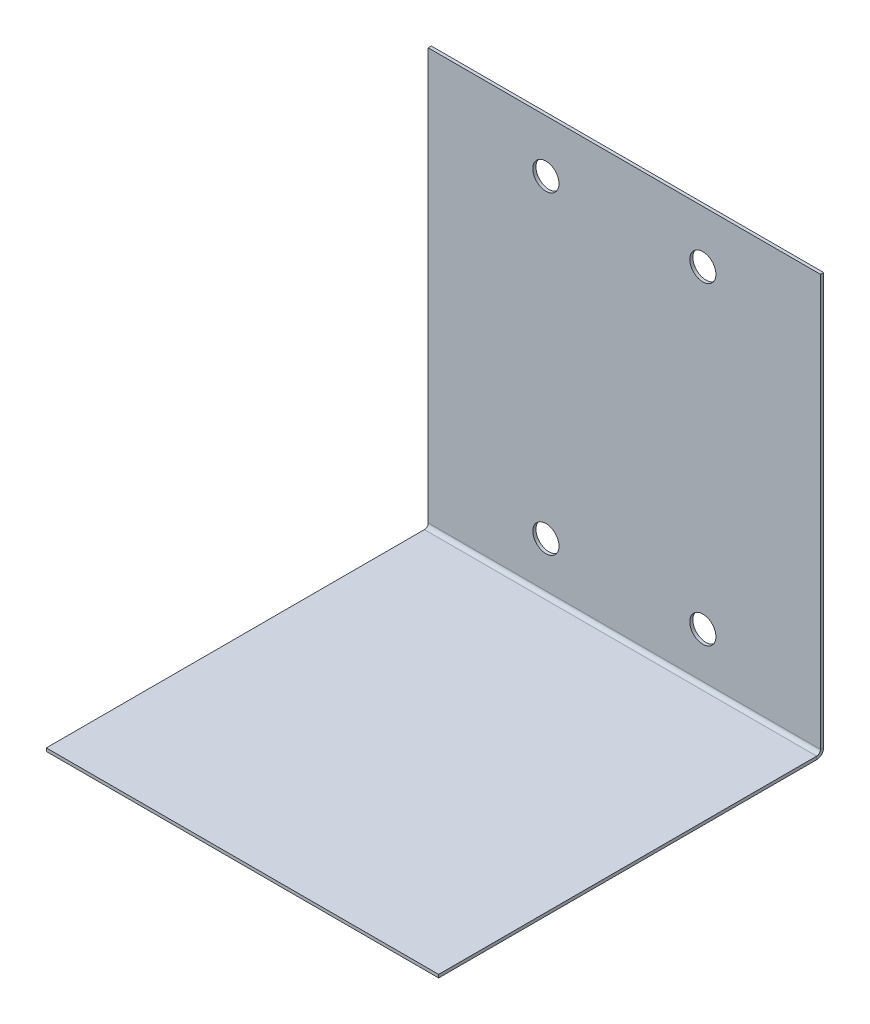
ISO-10303-21;
HEADER;
FILE_DESCRIPTION(('STEP AP214'),'2;1');
FILE_NAME('part.step','',(''),(''),'','','');
FILE_SCHEMA(('AUTOMOTIVE_DESIGN { 1 0 10303 214 1 1 1 1 }'));
ENDSEC;
DATA;
#1=APPLICATION_CONTEXT('core data for automotive mechanical design processes');
#2=APPLICATION_PROTOCOL_DEFINITION('international standard','automotive_design',2000,#1);
#3=PRODUCT_CONTEXT('',#1,'mechanical');
#4=PRODUCT('Part','Part','',(#3));
#5=PRODUCT_RELATED_PRODUCT_CATEGORY('part','',(#4));
#6=PRODUCT_DEFINITION_FORMATION('','',#4);
#7=PRODUCT_DEFINITION_CONTEXT('part definition',#1,'design');
#8=PRODUCT_DEFINITION('design','',#6,#7);
#9=PRODUCT_DEFINITION_SHAPE('','',#8);
#10=(LENGTH_UNIT() NAMED_UNIT(*) SI_UNIT(.MILLI.,.METRE.));
#11=(NAMED_UNIT(*) PLANE_ANGLE_UNIT() SI_UNIT($,.RADIAN.));
#12=(NAMED_UNIT(*) SI_UNIT($,.STERADIAN.) SOLID_ANGLE_UNIT());
#13=UNCERTAINTY_MEASURE_WITH_UNIT(LENGTH_MEASURE(1.E-05),#10,'distance_accuracy_value','');
#14=(GEOMETRIC_REPRESENTATION_CONTEXT(3) GLOBAL_UNCERTAINTY_ASSIGNED_CONTEXT((#13)) GLOBAL_UNIT_ASSIGNED_CONTEXT((#10,
#11,#12)) REPRESENTATION_CONTEXT('',''));
#15=CARTESIAN_POINT('',(0.,0.,0.));
#16=DIRECTION('',(0.,0.,1.));
#17=DIRECTION('',(1.,0.,0.));
#18=AXIS2_PLACEMENT_3D('',#15,#16,#17);
#19=CARTESIAN_POINT('',(75.,0.,-0.6));
#20=DIRECTION('',(1.,0.,0.));
#21=DIRECTION('',(0.,0.,-1.));
#22=AXIS2_PLACEMENT_3D('',#19,#20,#21);
#23=PLANE('',#22);
#24=DIRECTION('',(0.,1.,0.));
#25=VECTOR('',#24,1.);
#26=CARTESIAN_POINT('',(75.,0.,0.));
#27=LINE('',#26,#25);
#28=CARTESIAN_POINT('',(75.,1.3366,0.));
#29=VERTEX_POINT('',#28);
#30=CARTESIAN_POINT('',(75.,80.,0.));
#31=VERTEX_POINT('',#30);
#32=EDGE_CURVE('E107',#29,#31,#27,.T.);
#33=ORIENTED_EDGE('',*,*,#32,.F.);
#34=DIRECTION('',(0.,0.,-1.));
#35=VECTOR('',#34,1.);
#36=CARTESIAN_POINT('',(75.,1.3366,0.));
#37=LINE('',#36,#35);
#38=CARTESIAN_POINT('',(75.,1.3366,-0.6));
#39=VERTEX_POINT('',#38);
#40=EDGE_CURVE('E144',#29,#39,#37,.T.);
#41=ORIENTED_EDGE('',*,*,#40,.T.);
#42=DIRECTION('',(0.,1.,0.));
#43=VECTOR('',#42,1.);
#44=CARTESIAN_POINT('',(75.,0.,-0.6));
#45=LINE('',#44,#43);
#46=CARTESIAN_POINT('',(75.,80.,-0.6));
#47=VERTEX_POINT('',#46);
#48=EDGE_CURVE('E115',#39,#47,#45,.T.);
#49=ORIENTED_EDGE('',*,*,#48,.T.);
#50=DIRECTION('',(0.,0.,1.));
#51=VECTOR('',#50,1.);
#52=CARTESIAN_POINT('',(75.,80.,-0.6));
#53=LINE('',#52,#51);
#54=EDGE_CURVE('E63',#47,#31,#53,.T.);
#55=ORIENTED_EDGE('',*,*,#54,.T.);
#56=EDGE_LOOP('',(#33,#41,#49,#55));
#57=FACE_BOUND('',#56,.T.);
#58=ADVANCED_FACE('F59',(#57),#23,.T.);
#59=CARTESIAN_POINT('',(0.,0.,-0.6));
#60=DIRECTION('',(0.,0.,-1.));
#61=DIRECTION('',(-1.,0.,0.));
#62=AXIS2_PLACEMENT_3D('',#59,#60,#61);
#63=PLANE('',#62);
#64=CARTESIAN_POINT('',(22.5,10.,-0.6));
#65=DIRECTION('',(0.,0.,-1.));
#66=DIRECTION('',(-1.,0.,0.));
#67=AXIS2_PLACEMENT_3D('',#64,#65,#66);
#68=CIRCLE('',#67,2.5);
#69=CARTESIAN_POINT('',(20.,10.,-0.6));
#70=VERTEX_POINT('',#69);
#71=EDGE_CURVE('E123',#70,#70,#68,.T.);
#72=ORIENTED_EDGE('',*,*,#71,.F.);
#73=EDGE_LOOP('',(#72));
#74=FACE_BOUND('',#73,.T.);
#75=CARTESIAN_POINT('',(52.5,70.,-0.6));
#76=DIRECTION('',(0.,0.,-1.));
#77=DIRECTION('',(-1.,0.,0.));
#78=AXIS2_PLACEMENT_3D('',#75,#76,#77);
#79=CIRCLE('',#78,2.5);
#80=CARTESIAN_POINT('',(50.,70.,-0.6));
#81=VERTEX_POINT('',#80);
#82=EDGE_CURVE('E129',#81,#81,#79,.T.);
#83=ORIENTED_EDGE('',*,*,#82,.F.);
#84=EDGE_LOOP('',(#83));
#85=FACE_BOUND('',#84,.T.);
#86=CARTESIAN_POINT('',(52.5,9.99999999999999,-0.6));
#87=DIRECTION('',(0.,0.,-1.));
#88=DIRECTION('',(1.,0.,0.));
#89=AXIS2_PLACEMENT_3D('',#86,#87,#88);
#90=CIRCLE('',#89,2.49999999999999);
#91=CARTESIAN_POINT('',(55.,9.99999999999999,-0.6));
#92=VERTEX_POINT('',#91);
#93=EDGE_CURVE('E135',#92,#92,#90,.T.);
#94=ORIENTED_EDGE('',*,*,#93,.F.);
#95=EDGE_LOOP('',(#94));
#96=FACE_BOUND('',#95,.T.);
#97=CARTESIAN_POINT('',(22.5,70.,-0.6));
#98=DIRECTION('',(0.,0.,-1.));
#99=DIRECTION('',(1.,0.,0.));
#100=AXIS2_PLACEMENT_3D('',#97,#98,#99);
#101=CIRCLE('',#100,2.5);
#102=CARTESIAN_POINT('',(25.,70.,-0.6));
#103=VERTEX_POINT('',#102);
#104=EDGE_CURVE('E141',#103,#103,#101,.T.);
#105=ORIENTED_EDGE('',*,*,#104,.F.);
#106=EDGE_LOOP('',(#105));
#107=FACE_BOUND('',#106,.T.);
#108=ORIENTED_EDGE('',*,*,#48,.F.);
#109=DIRECTION('',(1.,0.,0.));
#110=VECTOR('',#109,1.);
#111=CARTESIAN_POINT('',(75.,1.3366,-0.6));
#112=LINE('',#111,#110);
#113=CARTESIAN_POINT('',(0.,1.3366,-0.6));
#114=VERTEX_POINT('',#113);
#115=EDGE_CURVE('E161',#39,#114,#112,.F.);
#116=ORIENTED_EDGE('',*,*,#115,.T.);
#117=DIRECTION('',(0.,-1.,0.));
#118=VECTOR('',#117,1.);
#119=CARTESIAN_POINT('',(0.,0.,-0.6));
#120=LINE('',#119,#118);
#121=CARTESIAN_POINT('',(0.,80.,-0.6));
#122=VERTEX_POINT('',#121);
#123=EDGE_CURVE('E113',#122,#114,#120,.T.);
#124=ORIENTED_EDGE('',*,*,#123,.F.);
#125=DIRECTION('',(-1.,0.,0.));
#126=VECTOR('',#125,1.);
#127=CARTESIAN_POINT('',(0.,80.,-0.6));
#128=LINE('',#127,#126);
#129=EDGE_CURVE('E99',#47,#122,#128,.T.);
#130=ORIENTED_EDGE('',*,*,#129,.F.);
#131=EDGE_LOOP('',(#108,#116,#124,#130));
#132=FACE_BOUND('',#131,.T.);
#133=ADVANCED_FACE('F251',(#74,#85,#96,#107,#132),#63,.T.);
#134=CARTESIAN_POINT('',(0.,0.,0.));
#135=DIRECTION('',(0.,0.,-1.));
#136=DIRECTION('',(-1.,0.,0.));
#137=AXIS2_PLACEMENT_3D('',#134,#135,#136);
#138=PLANE('',#137);
#139=CARTESIAN_POINT('',(22.5,10.,0.));
#140=DIRECTION('',(0.,0.,-1.));
#141=DIRECTION('',(-1.,0.,0.));
#142=AXIS2_PLACEMENT_3D('',#139,#140,#141);
#143=CIRCLE('',#142,2.5);
#144=CARTESIAN_POINT('',(20.,10.,0.));
#145=VERTEX_POINT('',#144);
#146=EDGE_CURVE('E108',#145,#145,#143,.F.);
#147=ORIENTED_EDGE('',*,*,#146,.F.);
#148=EDGE_LOOP('',(#147));
#149=FACE_BOUND('',#148,.T.);
#150=CARTESIAN_POINT('',(52.5,70.,0.));
#151=DIRECTION('',(0.,0.,-1.));
#152=DIRECTION('',(-1.,0.,0.));
#153=AXIS2_PLACEMENT_3D('',#150,#151,#152);
#154=CIRCLE('',#153,2.5);
#155=CARTESIAN_POINT('',(50.,70.,0.));
#156=VERTEX_POINT('',#155);
#157=EDGE_CURVE('E126',#156,#156,#154,.F.);
#158=ORIENTED_EDGE('',*,*,#157,.F.);
#159=EDGE_LOOP('',(#158));
#160=FACE_BOUND('',#159,.T.);
#161=CARTESIAN_POINT('',(52.5,9.99999999999999,0.));
#162=DIRECTION('',(0.,0.,-1.));
#163=DIRECTION('',(-1.,0.,0.));
#164=AXIS2_PLACEMENT_3D('',#161,#162,#163);
#165=CIRCLE('',#164,2.49999999999999);
#166=CARTESIAN_POINT('',(50.,9.99999999999999,0.));
#167=VERTEX_POINT('',#166);
#168=EDGE_CURVE('E132',#167,#167,#165,.F.);
#169=ORIENTED_EDGE('',*,*,#168,.F.);
#170=EDGE_LOOP('',(#169));
#171=FACE_BOUND('',#170,.T.);
#172=CARTESIAN_POINT('',(22.5,70.,0.));
#173=DIRECTION('',(0.,0.,-1.));
#174=DIRECTION('',(-1.,0.,0.));
#175=AXIS2_PLACEMENT_3D('',#172,#173,#174);
#176=CIRCLE('',#175,2.5);
#177=CARTESIAN_POINT('',(20.,70.,0.));
#178=VERTEX_POINT('',#177);
#179=EDGE_CURVE('E138',#178,#178,#176,.F.);
#180=ORIENTED_EDGE('',*,*,#179,.F.);
#181=EDGE_LOOP('',(#180));
#182=FACE_BOUND('',#181,.T.);
#183=DIRECTION('',(1.,0.,0.));
#184=VECTOR('',#183,1.);
#185=CARTESIAN_POINT('',(75.,1.3366,0.));
#186=LINE('',#185,#184);
#187=CARTESIAN_POINT('',(0.,1.3366,0.));
#188=VERTEX_POINT('',#187);
#189=EDGE_CURVE('E151',#29,#188,#186,.F.);
#190=ORIENTED_EDGE('',*,*,#189,.F.);
#191=ORIENTED_EDGE('',*,*,#32,.T.);
#192=DIRECTION('',(-1.,0.,0.));
#193=VECTOR('',#192,1.);
#194=CARTESIAN_POINT('',(0.,80.,0.));
#195=LINE('',#194,#193);
#196=CARTESIAN_POINT('',(0.,80.,0.));
#197=VERTEX_POINT('',#196);
#198=EDGE_CURVE('E97',#31,#197,#195,.T.);
#199=ORIENTED_EDGE('',*,*,#198,.T.);
#200=DIRECTION('',(0.,-1.,0.));
#201=VECTOR('',#200,1.);
#202=CARTESIAN_POINT('',(0.,0.,0.));
#203=LINE('',#202,#201);
#204=EDGE_CURVE('E102',#197,#188,#203,.T.);
#205=ORIENTED_EDGE('',*,*,#204,.T.);
#206=EDGE_LOOP('',(#190,#191,#199,#205));
#207=FACE_BOUND('',#206,.T.);
#208=ADVANCED_FACE('F110',(#149,#160,#171,#182,#207),#138,.F.);
#209=CARTESIAN_POINT('',(0.,0.,-0.6));
#210=DIRECTION('',(-1.,0.,0.));
#211=DIRECTION('',(0.,0.,1.));
#212=AXIS2_PLACEMENT_3D('',#209,#210,#211);
#213=PLANE('',#212);
#214=DIRECTION('',(0.,0.,-1.));
#215=VECTOR('',#214,1.);
#216=CARTESIAN_POINT('',(0.,1.3366,0.));
#217=LINE('',#216,#215);
#218=EDGE_CURVE('E104',#188,#114,#217,.T.);
#219=ORIENTED_EDGE('',*,*,#218,.F.);
#220=ORIENTED_EDGE('',*,*,#204,.F.);
#221=DIRECTION('',(0.,0.,1.));
#222=VECTOR('',#221,1.);
#223=CARTESIAN_POINT('',(0.,80.,-0.6));
#224=LINE('',#223,#222);
#225=EDGE_CURVE('E13',#122,#197,#224,.T.);
#226=ORIENTED_EDGE('',*,*,#225,.F.);
#227=ORIENTED_EDGE('',*,*,#123,.T.);
#228=EDGE_LOOP('',(#219,#220,#226,#227));
#229=FACE_BOUND('',#228,.T.);
#230=ADVANCED_FACE('F61',(#229),#213,.T.);
#231=CARTESIAN_POINT('',(0.,80.,-0.6));
#232=DIRECTION('',(0.,1.,0.));
#233=DIRECTION('',(0.,0.,1.));
#234=AXIS2_PLACEMENT_3D('',#231,#232,#233);
#235=PLANE('',#234);
#236=ORIENTED_EDGE('',*,*,#198,.F.);
#237=ORIENTED_EDGE('',*,*,#54,.F.);
#238=ORIENTED_EDGE('',*,*,#129,.T.);
#239=ORIENTED_EDGE('',*,*,#225,.T.);
#240=EDGE_LOOP('',(#236,#237,#238,#239));
#241=FACE_BOUND('',#240,.T.);
#242=ADVANCED_FACE('F94',(#241),#235,.T.);
#243=CARTESIAN_POINT('',(22.5,10.,0.00100000000000002));
#244=DIRECTION('',(0.,0.,-1.));
#245=DIRECTION('',(-1.,0.,0.));
#246=AXIS2_PLACEMENT_3D('',#243,#244,#245);
#247=CYLINDRICAL_SURFACE('',#246,2.5);
#248=ORIENTED_EDGE('',*,*,#71,.T.);
#249=EDGE_LOOP('',(#248));
#250=FACE_BOUND('',#249,.T.);
#251=ORIENTED_EDGE('',*,*,#146,.T.);
#252=EDGE_LOOP('',(#251));
#253=FACE_BOUND('',#252,.T.);
#254=ADVANCED_FACE('F275',(#250,#253),#247,.F.);
#255=CARTESIAN_POINT('',(52.5,70.,0.00100000000000002));
#256=DIRECTION('',(0.,0.,-1.));
#257=DIRECTION('',(-1.,0.,0.));
#258=AXIS2_PLACEMENT_3D('',#255,#256,#257);
#259=CYLINDRICAL_SURFACE('',#258,2.5);
#260=ORIENTED_EDGE('',*,*,#82,.T.);
#261=EDGE_LOOP('',(#260));
#262=FACE_BOUND('',#261,.T.);
#263=ORIENTED_EDGE('',*,*,#157,.T.);
#264=EDGE_LOOP('',(#263));
#265=FACE_BOUND('',#264,.T.);
#266=ADVANCED_FACE('F281',(#262,#265),#259,.F.);
#267=CARTESIAN_POINT('',(52.5,9.99999999999999,0.00100000000000002));
#268=DIRECTION('',(0.,0.,-1.));
#269=DIRECTION('',(-1.,0.,0.));
#270=AXIS2_PLACEMENT_3D('',#267,#268,#269);
#271=CYLINDRICAL_SURFACE('',#270,2.49999999999999);
#272=ORIENTED_EDGE('',*,*,#93,.T.);
#273=EDGE_LOOP('',(#272));
#274=FACE_BOUND('',#273,.T.);
#275=ORIENTED_EDGE('',*,*,#168,.T.);
#276=EDGE_LOOP('',(#275));
#277=FACE_BOUND('',#276,.T.);
#278=ADVANCED_FACE('F262',(#274,#277),#271,.F.);
#279=CARTESIAN_POINT('',(22.5,70.,0.00100000000000002));
#280=DIRECTION('',(0.,0.,-1.));
#281=DIRECTION('',(-1.,0.,0.));
#282=AXIS2_PLACEMENT_3D('',#279,#280,#281);
#283=CYLINDRICAL_SURFACE('',#282,2.5);
#284=ORIENTED_EDGE('',*,*,#104,.T.);
#285=EDGE_LOOP('',(#284));
#286=FACE_BOUND('',#285,.T.);
#287=ORIENTED_EDGE('',*,*,#179,.T.);
#288=EDGE_LOOP('',(#287));
#289=FACE_BOUND('',#288,.T.);
#290=ADVANCED_FACE('F255',(#286,#289),#283,.F.);
#291=CARTESIAN_POINT('',(0.,1.3366,0.7366));
#292=DIRECTION('',(-1.,0.,0.));
#293=DIRECTION('',(0.,0.,1.));
#294=AXIS2_PLACEMENT_3D('',#291,#292,#293);
#295=PLANE('',#294);
#296=DIRECTION('',(0.,1.,0.));
#297=VECTOR('',#296,1.);
#298=CARTESIAN_POINT('',(0.,0.,0.736599999999995));
#299=LINE('',#298,#297);
#300=CARTESIAN_POINT('',(0.,0.599999999999997,0.736599999999997));
#301=VERTEX_POINT('',#300);
#302=CARTESIAN_POINT('',(0.,0.,0.736599999999995));
#303=VERTEX_POINT('',#302);
#304=EDGE_CURVE('E165',#301,#303,#299,.F.);
#305=ORIENTED_EDGE('',*,*,#304,.F.);
#306=CARTESIAN_POINT('',(0.,1.3366,0.7366));
#307=DIRECTION('',(1.,0.,0.));
#308=DIRECTION('',(0.,0.,-1.));
#309=AXIS2_PLACEMENT_3D('',#306,#307,#308);
#310=CIRCLE('',#309,0.7366);
#311=EDGE_CURVE('E155',#188,#301,#310,.F.);
#312=ORIENTED_EDGE('',*,*,#311,.F.);
#313=ORIENTED_EDGE('',*,*,#218,.T.);
#314=CARTESIAN_POINT('',(0.,1.3366,0.7366));
#315=DIRECTION('',(1.,0.,0.));
#316=DIRECTION('',(0.,0.,-1.));
#317=AXIS2_PLACEMENT_3D('',#314,#315,#316);
#318=CIRCLE('',#317,1.3366);
#319=EDGE_CURVE('E74',#114,#303,#318,.F.);
#320=ORIENTED_EDGE('',*,*,#319,.T.);
#321=EDGE_LOOP('',(#305,#312,#313,#320));
#322=FACE_BOUND('',#321,.T.);
#323=ADVANCED_FACE('F253',(#322),#295,.T.);
#324=CARTESIAN_POINT('',(75.,1.3366,0.7366));
#325=DIRECTION('',(-1.,0.,0.));
#326=DIRECTION('',(0.,0.,1.));
#327=AXIS2_PLACEMENT_3D('',#324,#325,#326);
#328=PLANE('',#327);
#329=CARTESIAN_POINT('',(75.,1.3366,0.7366));
#330=DIRECTION('',(1.,0.,0.));
#331=DIRECTION('',(0.,0.,-1.));
#332=AXIS2_PLACEMENT_3D('',#329,#330,#331);
#333=CIRCLE('',#332,0.7366);
#334=CARTESIAN_POINT('',(75.,0.599999999999997,0.736599999999997));
#335=VERTEX_POINT('',#334);
#336=EDGE_CURVE('E148',#335,#29,#333,.T.);
#337=ORIENTED_EDGE('',*,*,#336,.F.);
#338=DIRECTION('',(0.,1.,0.));
#339=VECTOR('',#338,1.);
#340=CARTESIAN_POINT('',(75.,0.599999999999997,0.736599999999997));
#341=LINE('',#340,#339);
#342=CARTESIAN_POINT('',(75.,0.,0.736599999999995));
#343=VERTEX_POINT('',#342);
#344=EDGE_CURVE('E171',#335,#343,#341,.F.);
#345=ORIENTED_EDGE('',*,*,#344,.T.);
#346=CARTESIAN_POINT('',(75.,1.3366,0.7366));
#347=DIRECTION('',(1.,0.,0.));
#348=DIRECTION('',(0.,0.,-1.));
#349=AXIS2_PLACEMENT_3D('',#346,#347,#348);
#350=CIRCLE('',#349,1.3366);
#351=EDGE_CURVE('E158',#343,#39,#350,.T.);
#352=ORIENTED_EDGE('',*,*,#351,.T.);
#353=ORIENTED_EDGE('',*,*,#40,.F.);
#354=EDGE_LOOP('',(#337,#345,#352,#353));
#355=FACE_BOUND('',#354,.T.);
#356=ADVANCED_FACE('F245',(#355),#328,.F.);
#357=CARTESIAN_POINT('',(75.,1.3366,0.7366));
#358=DIRECTION('',(1.,0.,0.));
#359=DIRECTION('',(0.,-1.,0.));
#360=AXIS2_PLACEMENT_3D('',#357,#358,#359);
#361=CYLINDRICAL_SURFACE('',#360,1.3366);
#362=ORIENTED_EDGE('',*,*,#115,.F.);
#363=ORIENTED_EDGE('',*,*,#351,.F.);
#364=DIRECTION('',(1.,0.,0.));
#365=VECTOR('',#364,1.);
#366=CARTESIAN_POINT('',(0.,0.,0.736599999999995));
#367=LINE('',#366,#365);
#368=EDGE_CURVE('E174',#343,#303,#367,.F.);
#369=ORIENTED_EDGE('',*,*,#368,.T.);
#370=ORIENTED_EDGE('',*,*,#319,.F.);
#371=EDGE_LOOP('',(#362,#363,#369,#370));
#372=FACE_BOUND('',#371,.T.);
#373=ADVANCED_FACE('F252',(#372),#361,.T.);
#374=CARTESIAN_POINT('',(75.,1.3366,0.7366));
#375=DIRECTION('',(1.,0.,0.));
#376=DIRECTION('',(0.,-1.,0.));
#377=AXIS2_PLACEMENT_3D('',#374,#375,#376);
#378=CYLINDRICAL_SURFACE('',#377,0.7366);
#379=ORIENTED_EDGE('',*,*,#189,.T.);
#380=ORIENTED_EDGE('',*,*,#311,.T.);
#381=DIRECTION('',(1.,0.,0.));
#382=VECTOR('',#381,1.);
#383=CARTESIAN_POINT('',(0.,0.599999999999997,0.736599999999997));
#384=LINE('',#383,#382);
#385=EDGE_CURVE('E168',#301,#335,#384,.T.);
#386=ORIENTED_EDGE('',*,*,#385,.T.);
#387=ORIENTED_EDGE('',*,*,#336,.T.);
#388=EDGE_LOOP('',(#379,#380,#386,#387));
#389=FACE_BOUND('',#388,.T.);
#390=ADVANCED_FACE('F247',(#389),#378,.F.);
#391=CARTESIAN_POINT('',(0.,0.,0.));
#392=DIRECTION('',(1.,0.,0.));
#393=DIRECTION('',(0.,0.,-1.));
#394=AXIS2_PLACEMENT_3D('',#391,#392,#393);
#395=PLANE('',#394);
#396=ORIENTED_EDGE('',*,*,#304,.T.);
#397=DIRECTION('',(0.,0.,-1.));
#398=VECTOR('',#397,1.);
#399=CARTESIAN_POINT('',(0.,0.,0.));
#400=LINE('',#399,#398);
#401=CARTESIAN_POINT('',(0.,-2.54878137735549E-13,73.));
#402=VERTEX_POINT('',#401);
#403=EDGE_CURVE('E185',#402,#303,#400,.T.);
#404=ORIENTED_EDGE('',*,*,#403,.F.);
#405=DIRECTION('',(0.,1.,0.));
#406=VECTOR('',#405,1.);
#407=CARTESIAN_POINT('',(0.,-2.54878137735549E-13,73.));
#408=LINE('',#407,#406);
#409=CARTESIAN_POINT('',(0.,0.599999999999745,73.));
#410=VERTEX_POINT('',#409);
#411=EDGE_CURVE('E194',#402,#410,#408,.T.);
#412=ORIENTED_EDGE('',*,*,#411,.T.);
#413=DIRECTION('',(0.,0.,1.));
#414=VECTOR('',#413,1.);
#415=CARTESIAN_POINT('',(0.,0.6,0.));
#416=LINE('',#415,#414);
#417=EDGE_CURVE('E176',#410,#301,#416,.F.);
#418=ORIENTED_EDGE('',*,*,#417,.T.);
#419=EDGE_LOOP('',(#396,#404,#412,#418));
#420=FACE_BOUND('',#419,.T.);
#421=ADVANCED_FACE('F220',(#420),#395,.F.);
#422=CARTESIAN_POINT('',(75.,-2.54895930751342E-13,73.));
#423=DIRECTION('',(-1.,0.,0.));
#424=DIRECTION('',(0.,0.,1.));
#425=AXIS2_PLACEMENT_3D('',#422,#423,#424);
#426=PLANE('',#425);
#427=ORIENTED_EDGE('',*,*,#344,.F.);
#428=DIRECTION('',(0.,0.,-1.));
#429=VECTOR('',#428,1.);
#430=CARTESIAN_POINT('',(75.,0.599999999999745,73.));
#431=LINE('',#430,#429);
#432=CARTESIAN_POINT('',(75.,0.599999999999745,73.));
#433=VERTEX_POINT('',#432);
#434=EDGE_CURVE('E179',#335,#433,#431,.F.);
#435=ORIENTED_EDGE('',*,*,#434,.T.);
#436=DIRECTION('',(0.,1.,0.));
#437=VECTOR('',#436,1.);
#438=CARTESIAN_POINT('',(75.,-2.54895930751342E-13,73.));
#439=LINE('',#438,#437);
#440=CARTESIAN_POINT('',(75.,-2.54878137735549E-13,73.));
#441=VERTEX_POINT('',#440);
#442=EDGE_CURVE('E152',#441,#433,#439,.T.);
#443=ORIENTED_EDGE('',*,*,#442,.F.);
#444=DIRECTION('',(0.,0.,1.));
#445=VECTOR('',#444,1.);
#446=CARTESIAN_POINT('',(75.,0.,0.));
#447=LINE('',#446,#445);
#448=EDGE_CURVE('E188',#343,#441,#447,.T.);
#449=ORIENTED_EDGE('',*,*,#448,.F.);
#450=EDGE_LOOP('',(#427,#435,#443,#449));
#451=FACE_BOUND('',#450,.T.);
#452=ADVANCED_FACE('F242',(#451),#426,.F.);
#453=CARTESIAN_POINT('',(0.,0.,0.));
#454=DIRECTION('',(0.,1.,0.));
#455=DIRECTION('',(0.,0.,1.));
#456=AXIS2_PLACEMENT_3D('',#453,#454,#455);
#457=PLANE('',#456);
#458=ORIENTED_EDGE('',*,*,#368,.F.);
#459=ORIENTED_EDGE('',*,*,#448,.T.);
#460=DIRECTION('',(-1.,0.,0.));
#461=VECTOR('',#460,1.);
#462=CARTESIAN_POINT('',(0.,-2.54878137735549E-13,73.));
#463=LINE('',#462,#461);
#464=EDGE_CURVE('E191',#441,#402,#463,.T.);
#465=ORIENTED_EDGE('',*,*,#464,.T.);
#466=ORIENTED_EDGE('',*,*,#403,.T.);
#467=EDGE_LOOP('',(#458,#459,#465,#466));
#468=FACE_BOUND('',#467,.T.);
#469=ADVANCED_FACE('F240',(#468),#457,.F.);
#470=CARTESIAN_POINT('',(0.,0.6,0.));
#471=DIRECTION('',(0.,1.,0.));
#472=DIRECTION('',(0.,0.,1.));
#473=AXIS2_PLACEMENT_3D('',#470,#471,#472);
#474=PLANE('',#473);
#475=ORIENTED_EDGE('',*,*,#434,.F.);
#476=ORIENTED_EDGE('',*,*,#385,.F.);
#477=ORIENTED_EDGE('',*,*,#417,.F.);
#478=DIRECTION('',(1.,0.,0.));
#479=VECTOR('',#478,1.);
#480=CARTESIAN_POINT('',(0.,0.599999999999745,73.));
#481=LINE('',#480,#479);
#482=EDGE_CURVE('E182',#433,#410,#481,.F.);
#483=ORIENTED_EDGE('',*,*,#482,.F.);
#484=EDGE_LOOP('',(#475,#476,#477,#483));
#485=FACE_BOUND('',#484,.T.);
#486=ADVANCED_FACE('F214',(#485),#474,.T.);
#487=CARTESIAN_POINT('',(0.,-2.54895930751342E-13,73.));
#488=DIRECTION('',(0.,0.,-1.));
#489=DIRECTION('',(0.,1.,0.));
#490=AXIS2_PLACEMENT_3D('',#487,#488,#489);
#491=PLANE('',#490);
#492=ORIENTED_EDGE('',*,*,#482,.T.);
#493=ORIENTED_EDGE('',*,*,#411,.F.);
#494=ORIENTED_EDGE('',*,*,#464,.F.);
#495=ORIENTED_EDGE('',*,*,#442,.T.);
#496=EDGE_LOOP('',(#492,#493,#494,#495));
#497=FACE_BOUND('',#496,.T.);
#498=ADVANCED_FACE('F203',(#497),#491,.F.);
#499=CLOSED_SHELL('',(#58,#133,#208,#230,#242,#254,#266,#278,#290,#323,#356,#373,#390,#421,#452,
#469,#486,#498));
#500=MANIFOLD_SOLID_BREP('B2',#499);
#501=ADVANCED_BREP_SHAPE_REPRESENTATION('',(#18,#500),#14);
#502=SHAPE_DEFINITION_REPRESENTATION(#9,#501);
ENDSEC;
END-ISO-10303-21;
